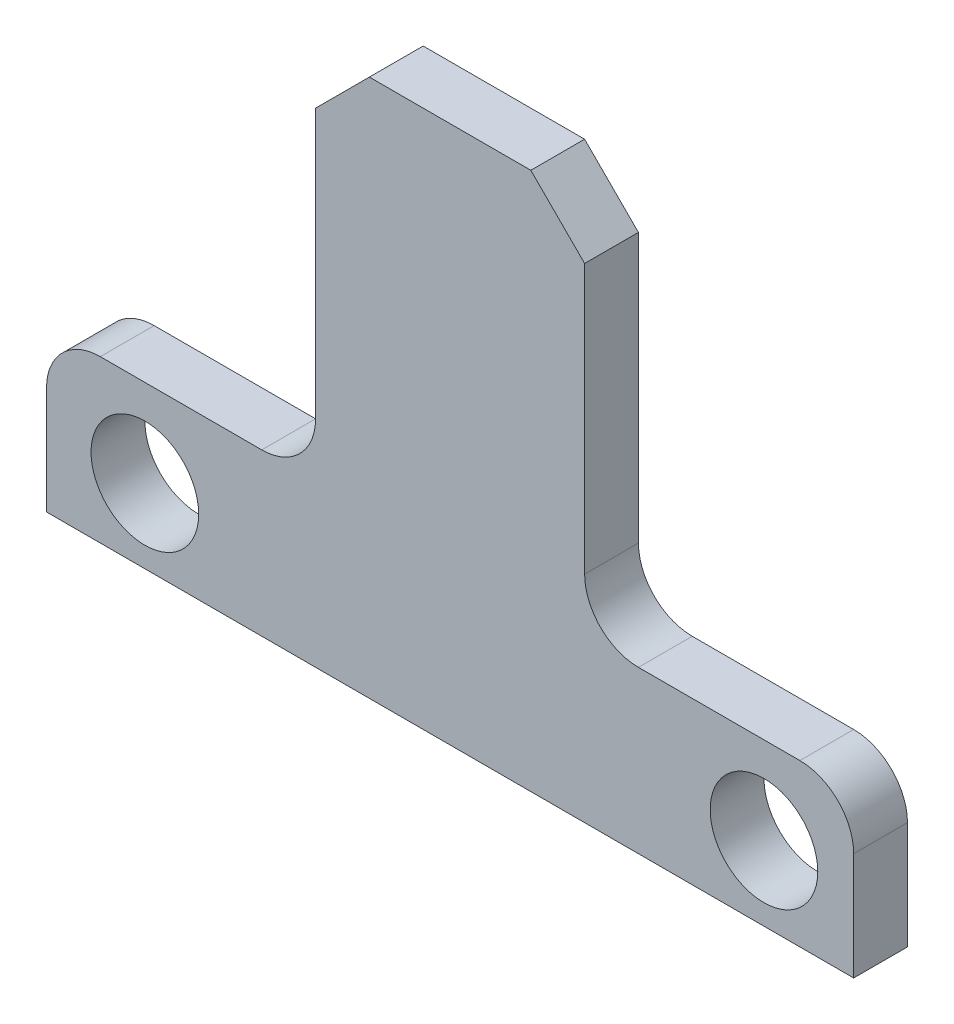
ISO-10303-21;
HEADER;
FILE_DESCRIPTION(('STEP AP214'),'2;1');
FILE_NAME('part.step','',(''),(''),'','','');
FILE_SCHEMA(('AUTOMOTIVE_DESIGN { 1 0 10303 214 1 1 1 1 }'));
ENDSEC;
DATA;
#1=APPLICATION_CONTEXT('core data for automotive mechanical design processes');
#2=APPLICATION_PROTOCOL_DEFINITION('international standard','automotive_design',2000,#1);
#3=PRODUCT_CONTEXT('',#1,'mechanical');
#4=PRODUCT('Part','Part','',(#3));
#5=PRODUCT_RELATED_PRODUCT_CATEGORY('part','',(#4));
#6=PRODUCT_DEFINITION_FORMATION('','',#4);
#7=PRODUCT_DEFINITION_CONTEXT('part definition',#1,'design');
#8=PRODUCT_DEFINITION('design','',#6,#7);
#9=PRODUCT_DEFINITION_SHAPE('','',#8);
#10=(LENGTH_UNIT() NAMED_UNIT(*) SI_UNIT(.MILLI.,.METRE.));
#11=(NAMED_UNIT(*) PLANE_ANGLE_UNIT() SI_UNIT($,.RADIAN.));
#12=(NAMED_UNIT(*) SI_UNIT($,.STERADIAN.) SOLID_ANGLE_UNIT());
#13=UNCERTAINTY_MEASURE_WITH_UNIT(LENGTH_MEASURE(1.E-05),#10,'distance_accuracy_value','');
#14=(GEOMETRIC_REPRESENTATION_CONTEXT(3) GLOBAL_UNCERTAINTY_ASSIGNED_CONTEXT((#13)) GLOBAL_UNIT_ASSIGNED_CONTEXT((#10,
#11,#12)) REPRESENTATION_CONTEXT('',''));
#15=CARTESIAN_POINT('',(0.,0.,0.));
#16=DIRECTION('',(0.,0.,1.));
#17=DIRECTION('',(1.,0.,0.));
#18=AXIS2_PLACEMENT_3D('',#15,#16,#17);
#19=CARTESIAN_POINT('',(-53.2727253400364,-24.3292399224025,10.));
#20=DIRECTION('',(0.,0.,-1.));
#21=DIRECTION('',(-1.,0.,0.));
#22=AXIS2_PLACEMENT_3D('',#19,#20,#21);
#23=PLANE('',#22);
#24=CARTESIAN_POINT('',(-53.2727253400364,-24.3292399224025,10.));
#25=DIRECTION('',(0.,0.,-1.));
#26=DIRECTION('',(-1.,0.,0.));
#27=AXIS2_PLACEMENT_3D('',#24,#25,#26);
#28=CIRCLE('',#27,10.);
#29=CARTESIAN_POINT('',(-43.2727253400364,-24.3292399224025,10.));
#30=VERTEX_POINT('',#29);
#31=CARTESIAN_POINT('',(-53.2727253400364,-34.3292399224025,10.));
#32=VERTEX_POINT('',#31);
#33=EDGE_CURVE('E222',#30,#32,#28,.T.);
#34=ORIENTED_EDGE('',*,*,#33,.T.);
#35=DIRECTION('',(-1.,0.,0.));
#36=VECTOR('',#35,1.);
#37=CARTESIAN_POINT('',(-53.2727253400364,-34.3292399224025,10.));
#38=LINE('',#37,#36);
#39=CARTESIAN_POINT('',(-83.2727253400364,-34.3292399224025,10.));
#40=VERTEX_POINT('',#39);
#41=EDGE_CURVE('E122',#32,#40,#38,.T.);
#42=ORIENTED_EDGE('',*,*,#41,.T.);
#43=CARTESIAN_POINT('',(-83.2727253400364,-44.3292399224025,10.));
#44=DIRECTION('',(0.,0.,1.));
#45=DIRECTION('',(1.,0.,0.));
#46=AXIS2_PLACEMENT_3D('',#43,#44,#45);
#47=CIRCLE('',#46,10.);
#48=CARTESIAN_POINT('',(-93.2727253400364,-44.3292399224025,10.));
#49=VERTEX_POINT('',#48);
#50=EDGE_CURVE('E267',#40,#49,#47,.T.);
#51=ORIENTED_EDGE('',*,*,#50,.T.);
#52=DIRECTION('',(0.,-1.,0.));
#53=VECTOR('',#52,1.);
#54=CARTESIAN_POINT('',(-93.2727253400364,-44.3292399224025,10.));
#55=LINE('',#54,#53);
#56=CARTESIAN_POINT('',(-93.2727253400364,-64.3292399224025,10.));
#57=VERTEX_POINT('',#56);
#58=EDGE_CURVE('E287',#49,#57,#55,.T.);
#59=ORIENTED_EDGE('',*,*,#58,.T.);
#60=DIRECTION('',(1.,0.,0.));
#61=VECTOR('',#60,1.);
#62=CARTESIAN_POINT('',(-93.2727253400364,-64.3292399224025,10.));
#63=LINE('',#62,#61);
#64=CARTESIAN_POINT('',(56.7272746599636,-64.3292399224025,10.));
#65=VERTEX_POINT('',#64);
#66=EDGE_CURVE('E283',#57,#65,#63,.T.);
#67=ORIENTED_EDGE('',*,*,#66,.T.);
#68=DIRECTION('',(0.,1.,0.));
#69=VECTOR('',#68,1.);
#70=CARTESIAN_POINT('',(56.7272746599636,-44.3292399224025,10.));
#71=LINE('',#70,#69);
#72=CARTESIAN_POINT('',(56.7272746599636,-44.3292399224025,10.));
#73=VERTEX_POINT('',#72);
#74=EDGE_CURVE('E286',#65,#73,#71,.T.);
#75=ORIENTED_EDGE('',*,*,#74,.T.);
#76=CARTESIAN_POINT('',(46.7272746599636,-44.3292399224025,10.));
#77=DIRECTION('',(0.,0.,1.));
#78=DIRECTION('',(-1.,0.,0.));
#79=AXIS2_PLACEMENT_3D('',#76,#77,#78);
#80=CIRCLE('',#79,10.);
#81=CARTESIAN_POINT('',(46.7272746599636,-34.3292399224025,10.));
#82=VERTEX_POINT('',#81);
#83=EDGE_CURVE('E291',#73,#82,#80,.T.);
#84=ORIENTED_EDGE('',*,*,#83,.T.);
#85=DIRECTION('',(-1.,0.,0.));
#86=VECTOR('',#85,1.);
#87=CARTESIAN_POINT('',(16.7272746599636,-34.3292399224025,10.));
#88=LINE('',#87,#86);
#89=CARTESIAN_POINT('',(16.7272746599636,-34.3292399224025,10.));
#90=VERTEX_POINT('',#89);
#91=EDGE_CURVE('E298',#82,#90,#88,.T.);
#92=ORIENTED_EDGE('',*,*,#91,.T.);
#93=CARTESIAN_POINT('',(16.7272746599636,-24.3292399224025,10.));
#94=DIRECTION('',(0.,0.,-1.));
#95=DIRECTION('',(1.,0.,0.));
#96=AXIS2_PLACEMENT_3D('',#93,#94,#95);
#97=CIRCLE('',#96,10.);
#98=CARTESIAN_POINT('',(6.72727465996364,-24.3292399224025,10.));
#99=VERTEX_POINT('',#98);
#100=EDGE_CURVE('E301',#90,#99,#97,.T.);
#101=ORIENTED_EDGE('',*,*,#100,.T.);
#102=DIRECTION('',(0.,1.,0.));
#103=VECTOR('',#102,1.);
#104=CARTESIAN_POINT('',(6.72727465996363,25.6707600775975,10.));
#105=LINE('',#104,#103);
#106=CARTESIAN_POINT('',(6.72727465996363,25.6707600775975,10.));
#107=VERTEX_POINT('',#106);
#108=EDGE_CURVE('E304',#99,#107,#105,.T.);
#109=ORIENTED_EDGE('',*,*,#108,.T.);
#110=DIRECTION('',(-0.707106781186548,0.707106781186548,0.));
#111=VECTOR('',#110,1.);
#112=CARTESIAN_POINT('',(-3.27272534003637,35.6707600775975,10.));
#113=LINE('',#112,#111);
#114=CARTESIAN_POINT('',(-3.27272534003637,35.6707600775975,10.));
#115=VERTEX_POINT('',#114);
#116=EDGE_CURVE('E159',#107,#115,#113,.T.);
#117=ORIENTED_EDGE('',*,*,#116,.T.);
#118=DIRECTION('',(-1.,0.,0.));
#119=VECTOR('',#118,1.);
#120=CARTESIAN_POINT('',(-33.2727253400364,35.6707600775975,10.));
#121=LINE('',#120,#119);
#122=CARTESIAN_POINT('',(-33.2727253400364,35.6707600775975,10.));
#123=VERTEX_POINT('',#122);
#124=EDGE_CURVE('E153',#115,#123,#121,.T.);
#125=ORIENTED_EDGE('',*,*,#124,.T.);
#126=DIRECTION('',(-0.707106781186548,-0.707106781186548,0.));
#127=VECTOR('',#126,1.);
#128=CARTESIAN_POINT('',(-43.2727253400364,25.6707600775975,10.));
#129=LINE('',#128,#127);
#130=CARTESIAN_POINT('',(-43.2727253400364,25.6707600775975,10.));
#131=VERTEX_POINT('',#130);
#132=EDGE_CURVE('E157',#123,#131,#129,.T.);
#133=ORIENTED_EDGE('',*,*,#132,.T.);
#134=DIRECTION('',(0.,-1.,0.));
#135=VECTOR('',#134,1.);
#136=CARTESIAN_POINT('',(-43.2727253400364,25.6707600775975,10.));
#137=LINE('',#136,#135);
#138=EDGE_CURVE('E61',#131,#30,#137,.T.);
#139=ORIENTED_EDGE('',*,*,#138,.T.);
#140=EDGE_LOOP('',(#34,#42,#51,#59,#67,#75,#84,#92,#101,#109,#117,#125,#133,#139));
#141=FACE_BOUND('',#140,.T.);
#142=CARTESIAN_POINT('',(-74.9963111467522,-50.5463211682411,10.));
#143=DIRECTION('',(0.,0.,1.));
#144=DIRECTION('',(1.,0.,0.));
#145=AXIS2_PLACEMENT_3D('',#142,#143,#144);
#146=CIRCLE('',#145,9.99999999999999);
#147=CARTESIAN_POINT('',(-64.9963111467522,-50.5463211682411,10.));
#148=VERTEX_POINT('',#147);
#149=EDGE_CURVE('E186',#148,#148,#146,.T.);
#150=ORIENTED_EDGE('',*,*,#149,.F.);
#151=EDGE_LOOP('',(#150));
#152=FACE_BOUND('',#151,.T.);
#153=CARTESIAN_POINT('',(40.0565092674661,-50.5463211682411,10.));
#154=DIRECTION('',(0.,0.,1.));
#155=DIRECTION('',(1.,0.,0.));
#156=AXIS2_PLACEMENT_3D('',#153,#154,#155);
#157=CIRCLE('',#156,10.);
#158=CARTESIAN_POINT('',(50.0565092674661,-50.5463211682411,10.));
#159=VERTEX_POINT('',#158);
#160=EDGE_CURVE('E347',#159,#159,#157,.T.);
#161=ORIENTED_EDGE('',*,*,#160,.F.);
#162=EDGE_LOOP('',(#161));
#163=FACE_BOUND('',#162,.T.);
#164=ADVANCED_FACE('F43',(#141,#152,#163),#23,.F.);
#165=CARTESIAN_POINT('',(-53.2727253400364,-24.3292399224025,0.));
#166=DIRECTION('',(0.,0.,-1.));
#167=DIRECTION('',(-1.,0.,0.));
#168=AXIS2_PLACEMENT_3D('',#165,#166,#167);
#169=PLANE('',#168);
#170=CARTESIAN_POINT('',(-74.9963111467522,-50.5463211682411,0.));
#171=DIRECTION('',(0.,0.,1.));
#172=DIRECTION('',(1.,0.,0.));
#173=AXIS2_PLACEMENT_3D('',#170,#171,#172);
#174=CIRCLE('',#173,9.99999999999999);
#175=CARTESIAN_POINT('',(-64.9963111467522,-50.5463211682411,0.));
#176=VERTEX_POINT('',#175);
#177=EDGE_CURVE('E354',#176,#176,#174,.T.);
#178=ORIENTED_EDGE('',*,*,#177,.T.);
#179=EDGE_LOOP('',(#178));
#180=FACE_BOUND('',#179,.T.);
#181=CARTESIAN_POINT('',(-53.2727253400364,-24.3292399224025,0.));
#182=DIRECTION('',(0.,0.,-1.));
#183=DIRECTION('',(-1.,0.,0.));
#184=AXIS2_PLACEMENT_3D('',#181,#182,#183);
#185=CIRCLE('',#184,10.);
#186=CARTESIAN_POINT('',(-43.2727253400364,-24.3292399224025,0.));
#187=VERTEX_POINT('',#186);
#188=CARTESIAN_POINT('',(-53.2727253400364,-34.3292399224025,0.));
#189=VERTEX_POINT('',#188);
#190=EDGE_CURVE('E181',#187,#189,#185,.T.);
#191=ORIENTED_EDGE('',*,*,#190,.F.);
#192=DIRECTION('',(0.,-1.,0.));
#193=VECTOR('',#192,1.);
#194=CARTESIAN_POINT('',(-43.2727253400364,25.6707600775975,0.));
#195=LINE('',#194,#193);
#196=CARTESIAN_POINT('',(-43.2727253400364,25.6707600775975,0.));
#197=VERTEX_POINT('',#196);
#198=EDGE_CURVE('E114',#197,#187,#195,.T.);
#199=ORIENTED_EDGE('',*,*,#198,.F.);
#200=DIRECTION('',(-0.707106781186548,-0.707106781186548,0.));
#201=VECTOR('',#200,1.);
#202=CARTESIAN_POINT('',(-43.2727253400364,25.6707600775975,0.));
#203=LINE('',#202,#201);
#204=CARTESIAN_POINT('',(-33.2727253400364,35.6707600775975,0.));
#205=VERTEX_POINT('',#204);
#206=EDGE_CURVE('E108',#205,#197,#203,.T.);
#207=ORIENTED_EDGE('',*,*,#206,.F.);
#208=DIRECTION('',(-1.,0.,0.));
#209=VECTOR('',#208,1.);
#210=CARTESIAN_POINT('',(-33.2727253400364,35.6707600775975,0.));
#211=LINE('',#210,#209);
#212=CARTESIAN_POINT('',(-3.27272534003637,35.6707600775975,0.));
#213=VERTEX_POINT('',#212);
#214=EDGE_CURVE('E168',#213,#205,#211,.T.);
#215=ORIENTED_EDGE('',*,*,#214,.F.);
#216=DIRECTION('',(-0.707106781186548,0.707106781186548,0.));
#217=VECTOR('',#216,1.);
#218=CARTESIAN_POINT('',(-3.27272534003637,35.6707600775975,0.));
#219=LINE('',#218,#217);
#220=CARTESIAN_POINT('',(6.72727465996363,25.6707600775975,0.));
#221=VERTEX_POINT('',#220);
#222=EDGE_CURVE('E213',#221,#213,#219,.T.);
#223=ORIENTED_EDGE('',*,*,#222,.F.);
#224=DIRECTION('',(0.,1.,0.));
#225=VECTOR('',#224,1.);
#226=CARTESIAN_POINT('',(6.72727465996363,25.6707600775975,0.));
#227=LINE('',#226,#225);
#228=CARTESIAN_POINT('',(6.72727465996364,-24.3292399224025,0.));
#229=VERTEX_POINT('',#228);
#230=EDGE_CURVE('E210',#229,#221,#227,.T.);
#231=ORIENTED_EDGE('',*,*,#230,.F.);
#232=CARTESIAN_POINT('',(16.7272746599636,-24.3292399224025,0.));
#233=DIRECTION('',(0.,0.,-1.));
#234=DIRECTION('',(1.,0.,0.));
#235=AXIS2_PLACEMENT_3D('',#232,#233,#234);
#236=CIRCLE('',#235,10.);
#237=CARTESIAN_POINT('',(16.7272746599636,-34.3292399224025,0.));
#238=VERTEX_POINT('',#237);
#239=EDGE_CURVE('E207',#238,#229,#236,.T.);
#240=ORIENTED_EDGE('',*,*,#239,.F.);
#241=DIRECTION('',(-1.,0.,0.));
#242=VECTOR('',#241,1.);
#243=CARTESIAN_POINT('',(16.7272746599636,-34.3292399224025,0.));
#244=LINE('',#243,#242);
#245=CARTESIAN_POINT('',(46.7272746599636,-34.3292399224025,0.));
#246=VERTEX_POINT('',#245);
#247=EDGE_CURVE('E204',#246,#238,#244,.T.);
#248=ORIENTED_EDGE('',*,*,#247,.F.);
#249=CARTESIAN_POINT('',(46.7272746599636,-44.3292399224025,0.));
#250=DIRECTION('',(0.,0.,1.));
#251=DIRECTION('',(-1.,0.,0.));
#252=AXIS2_PLACEMENT_3D('',#249,#250,#251);
#253=CIRCLE('',#252,10.);
#254=CARTESIAN_POINT('',(56.7272746599636,-44.3292399224025,0.));
#255=VERTEX_POINT('',#254);
#256=EDGE_CURVE('E201',#255,#246,#253,.T.);
#257=ORIENTED_EDGE('',*,*,#256,.F.);
#258=DIRECTION('',(0.,1.,0.));
#259=VECTOR('',#258,1.);
#260=CARTESIAN_POINT('',(56.7272746599636,-44.3292399224025,0.));
#261=LINE('',#260,#259);
#262=CARTESIAN_POINT('',(56.7272746599636,-64.3292399224025,0.));
#263=VERTEX_POINT('',#262);
#264=EDGE_CURVE('E198',#263,#255,#261,.T.);
#265=ORIENTED_EDGE('',*,*,#264,.F.);
#266=DIRECTION('',(1.,0.,0.));
#267=VECTOR('',#266,1.);
#268=CARTESIAN_POINT('',(-93.2727253400364,-64.3292399224025,0.));
#269=LINE('',#268,#267);
#270=CARTESIAN_POINT('',(-93.2727253400364,-64.3292399224025,0.));
#271=VERTEX_POINT('',#270);
#272=EDGE_CURVE('E195',#271,#263,#269,.T.);
#273=ORIENTED_EDGE('',*,*,#272,.F.);
#274=DIRECTION('',(0.,-1.,0.));
#275=VECTOR('',#274,1.);
#276=CARTESIAN_POINT('',(-93.2727253400364,-44.3292399224025,0.));
#277=LINE('',#276,#275);
#278=CARTESIAN_POINT('',(-93.2727253400364,-44.3292399224025,0.));
#279=VERTEX_POINT('',#278);
#280=EDGE_CURVE('E192',#279,#271,#277,.T.);
#281=ORIENTED_EDGE('',*,*,#280,.F.);
#282=CARTESIAN_POINT('',(-83.2727253400364,-44.3292399224025,0.));
#283=DIRECTION('',(0.,0.,1.));
#284=DIRECTION('',(1.,0.,0.));
#285=AXIS2_PLACEMENT_3D('',#282,#283,#284);
#286=CIRCLE('',#285,10.);
#287=CARTESIAN_POINT('',(-83.2727253400364,-34.3292399224025,0.));
#288=VERTEX_POINT('',#287);
#289=EDGE_CURVE('E189',#288,#279,#286,.T.);
#290=ORIENTED_EDGE('',*,*,#289,.F.);
#291=DIRECTION('',(-1.,0.,0.));
#292=VECTOR('',#291,1.);
#293=CARTESIAN_POINT('',(-53.2727253400364,-34.3292399224025,0.));
#294=LINE('',#293,#292);
#295=EDGE_CURVE('E185',#189,#288,#294,.T.);
#296=ORIENTED_EDGE('',*,*,#295,.F.);
#297=EDGE_LOOP('',(#191,#199,#207,#215,#223,#231,#240,#248,#257,#265,#273,#281,#290,#296));
#298=FACE_BOUND('',#297,.T.);
#299=CARTESIAN_POINT('',(40.0565092674661,-50.5463211682411,0.));
#300=DIRECTION('',(0.,0.,1.));
#301=DIRECTION('',(1.,0.,0.));
#302=AXIS2_PLACEMENT_3D('',#299,#300,#301);
#303=CIRCLE('',#302,10.);
#304=CARTESIAN_POINT('',(50.0565092674661,-50.5463211682411,0.));
#305=VERTEX_POINT('',#304);
#306=EDGE_CURVE('E350',#305,#305,#303,.T.);
#307=ORIENTED_EDGE('',*,*,#306,.T.);
#308=EDGE_LOOP('',(#307));
#309=FACE_BOUND('',#308,.T.);
#310=ADVANCED_FACE('F271',(#180,#298,#309),#169,.T.);
#311=CARTESIAN_POINT('',(-53.2727253400364,-24.3292399224025,10.));
#312=DIRECTION('',(0.,0.,-1.));
#313=DIRECTION('',(-1.,0.,0.));
#314=AXIS2_PLACEMENT_3D('',#311,#312,#313);
#315=CYLINDRICAL_SURFACE('',#314,10.);
#316=ORIENTED_EDGE('',*,*,#190,.T.);
#317=DIRECTION('',(0.,0.,-1.));
#318=VECTOR('',#317,1.);
#319=CARTESIAN_POINT('',(-53.2727253400364,-34.3292399224025,10.));
#320=LINE('',#319,#318);
#321=EDGE_CURVE('E11',#32,#189,#320,.T.);
#322=ORIENTED_EDGE('',*,*,#321,.F.);
#323=ORIENTED_EDGE('',*,*,#33,.F.);
#324=DIRECTION('',(0.,0.,-1.));
#325=VECTOR('',#324,1.);
#326=CARTESIAN_POINT('',(-43.2727253400364,-24.3292399224025,10.));
#327=LINE('',#326,#325);
#328=EDGE_CURVE('E177',#30,#187,#327,.T.);
#329=ORIENTED_EDGE('',*,*,#328,.T.);
#330=EDGE_LOOP('',(#316,#322,#323,#329));
#331=FACE_BOUND('',#330,.T.);
#332=ADVANCED_FACE('F45',(#331),#315,.F.);
#333=CARTESIAN_POINT('',(-53.2727253400364,-34.3292399224025,10.));
#334=DIRECTION('',(0.,-1.,0.));
#335=DIRECTION('',(0.,0.,-1.));
#336=AXIS2_PLACEMENT_3D('',#333,#334,#335);
#337=PLANE('',#336);
#338=ORIENTED_EDGE('',*,*,#295,.T.);
#339=DIRECTION('',(0.,0.,-1.));
#340=VECTOR('',#339,1.);
#341=CARTESIAN_POINT('',(-83.2727253400364,-34.3292399224025,10.));
#342=LINE('',#341,#340);
#343=EDGE_CURVE('E53',#40,#288,#342,.T.);
#344=ORIENTED_EDGE('',*,*,#343,.F.);
#345=ORIENTED_EDGE('',*,*,#41,.F.);
#346=ORIENTED_EDGE('',*,*,#321,.T.);
#347=EDGE_LOOP('',(#338,#344,#345,#346));
#348=FACE_BOUND('',#347,.T.);
#349=ADVANCED_FACE('F486',(#348),#337,.F.);
#350=CARTESIAN_POINT('',(-83.2727253400364,-44.3292399224025,10.));
#351=DIRECTION('',(0.,0.,-1.));
#352=DIRECTION('',(-1.,0.,0.));
#353=AXIS2_PLACEMENT_3D('',#350,#351,#352);
#354=CYLINDRICAL_SURFACE('',#353,10.);
#355=ORIENTED_EDGE('',*,*,#289,.T.);
#356=DIRECTION('',(0.,0.,-1.));
#357=VECTOR('',#356,1.);
#358=CARTESIAN_POINT('',(-93.2727253400364,-44.3292399224025,10.));
#359=LINE('',#358,#357);
#360=EDGE_CURVE('E257',#49,#279,#359,.T.);
#361=ORIENTED_EDGE('',*,*,#360,.F.);
#362=ORIENTED_EDGE('',*,*,#50,.F.);
#363=ORIENTED_EDGE('',*,*,#343,.T.);
#364=EDGE_LOOP('',(#355,#361,#362,#363));
#365=FACE_BOUND('',#364,.T.);
#366=ADVANCED_FACE('F265',(#365),#354,.T.);
#367=CARTESIAN_POINT('',(-93.2727253400364,-44.3292399224025,10.));
#368=DIRECTION('',(1.,0.,0.));
#369=DIRECTION('',(0.,0.,-1.));
#370=AXIS2_PLACEMENT_3D('',#367,#368,#369);
#371=PLANE('',#370);
#372=ORIENTED_EDGE('',*,*,#280,.T.);
#373=DIRECTION('',(0.,0.,-1.));
#374=VECTOR('',#373,1.);
#375=CARTESIAN_POINT('',(-93.2727253400364,-64.3292399224025,10.));
#376=LINE('',#375,#374);
#377=EDGE_CURVE('E253',#57,#271,#376,.T.);
#378=ORIENTED_EDGE('',*,*,#377,.F.);
#379=ORIENTED_EDGE('',*,*,#58,.F.);
#380=ORIENTED_EDGE('',*,*,#360,.T.);
#381=EDGE_LOOP('',(#372,#378,#379,#380));
#382=FACE_BOUND('',#381,.T.);
#383=ADVANCED_FACE('F277',(#382),#371,.F.);
#384=CARTESIAN_POINT('',(-93.2727253400364,-64.3292399224025,10.));
#385=DIRECTION('',(0.,1.,0.));
#386=DIRECTION('',(0.,0.,1.));
#387=AXIS2_PLACEMENT_3D('',#384,#385,#386);
#388=PLANE('',#387);
#389=ORIENTED_EDGE('',*,*,#272,.T.);
#390=DIRECTION('',(0.,0.,-1.));
#391=VECTOR('',#390,1.);
#392=CARTESIAN_POINT('',(56.7272746599636,-64.3292399224025,10.));
#393=LINE('',#392,#391);
#394=EDGE_CURVE('E249',#65,#263,#393,.T.);
#395=ORIENTED_EDGE('',*,*,#394,.F.);
#396=ORIENTED_EDGE('',*,*,#66,.F.);
#397=ORIENTED_EDGE('',*,*,#377,.T.);
#398=EDGE_LOOP('',(#389,#395,#396,#397));
#399=FACE_BOUND('',#398,.T.);
#400=ADVANCED_FACE('F281',(#399),#388,.F.);
#401=CARTESIAN_POINT('',(56.7272746599636,-44.3292399224025,10.));
#402=DIRECTION('',(-1.,0.,0.));
#403=DIRECTION('',(0.,0.,1.));
#404=AXIS2_PLACEMENT_3D('',#401,#402,#403);
#405=PLANE('',#404);
#406=ORIENTED_EDGE('',*,*,#264,.T.);
#407=DIRECTION('',(0.,0.,-1.));
#408=VECTOR('',#407,1.);
#409=CARTESIAN_POINT('',(56.7272746599636,-44.3292399224025,10.));
#410=LINE('',#409,#408);
#411=EDGE_CURVE('E245',#73,#255,#410,.T.);
#412=ORIENTED_EDGE('',*,*,#411,.F.);
#413=ORIENTED_EDGE('',*,*,#74,.F.);
#414=ORIENTED_EDGE('',*,*,#394,.T.);
#415=EDGE_LOOP('',(#406,#412,#413,#414));
#416=FACE_BOUND('',#415,.T.);
#417=ADVANCED_FACE('F447',(#416),#405,.F.);
#418=CARTESIAN_POINT('',(46.7272746599636,-44.3292399224025,10.));
#419=DIRECTION('',(0.,0.,-1.));
#420=DIRECTION('',(-1.,0.,0.));
#421=AXIS2_PLACEMENT_3D('',#418,#419,#420);
#422=CYLINDRICAL_SURFACE('',#421,10.);
#423=ORIENTED_EDGE('',*,*,#256,.T.);
#424=DIRECTION('',(0.,0.,-1.));
#425=VECTOR('',#424,1.);
#426=CARTESIAN_POINT('',(46.7272746599636,-34.3292399224025,10.));
#427=LINE('',#426,#425);
#428=EDGE_CURVE('E241',#82,#246,#427,.T.);
#429=ORIENTED_EDGE('',*,*,#428,.F.);
#430=ORIENTED_EDGE('',*,*,#83,.F.);
#431=ORIENTED_EDGE('',*,*,#411,.T.);
#432=EDGE_LOOP('',(#423,#429,#430,#431));
#433=FACE_BOUND('',#432,.T.);
#434=ADVANCED_FACE('F436',(#433),#422,.T.);
#435=CARTESIAN_POINT('',(16.7272746599636,-34.3292399224025,10.));
#436=DIRECTION('',(0.,-1.,0.));
#437=DIRECTION('',(0.,0.,-1.));
#438=AXIS2_PLACEMENT_3D('',#435,#436,#437);
#439=PLANE('',#438);
#440=ORIENTED_EDGE('',*,*,#247,.T.);
#441=DIRECTION('',(0.,0.,-1.));
#442=VECTOR('',#441,1.);
#443=CARTESIAN_POINT('',(16.7272746599636,-34.3292399224025,10.));
#444=LINE('',#443,#442);
#445=EDGE_CURVE('E237',#90,#238,#444,.T.);
#446=ORIENTED_EDGE('',*,*,#445,.F.);
#447=ORIENTED_EDGE('',*,*,#91,.F.);
#448=ORIENTED_EDGE('',*,*,#428,.T.);
#449=EDGE_LOOP('',(#440,#446,#447,#448));
#450=FACE_BOUND('',#449,.T.);
#451=ADVANCED_FACE('F425',(#450),#439,.F.);
#452=CARTESIAN_POINT('',(16.7272746599636,-24.3292399224025,10.));
#453=DIRECTION('',(0.,0.,-1.));
#454=DIRECTION('',(-1.,0.,0.));
#455=AXIS2_PLACEMENT_3D('',#452,#453,#454);
#456=CYLINDRICAL_SURFACE('',#455,10.);
#457=ORIENTED_EDGE('',*,*,#239,.T.);
#458=DIRECTION('',(0.,0.,-1.));
#459=VECTOR('',#458,1.);
#460=CARTESIAN_POINT('',(6.72727465996364,-24.3292399224025,10.));
#461=LINE('',#460,#459);
#462=EDGE_CURVE('E233',#99,#229,#461,.T.);
#463=ORIENTED_EDGE('',*,*,#462,.F.);
#464=ORIENTED_EDGE('',*,*,#100,.F.);
#465=ORIENTED_EDGE('',*,*,#445,.T.);
#466=EDGE_LOOP('',(#457,#463,#464,#465));
#467=FACE_BOUND('',#466,.T.);
#468=ADVANCED_FACE('F415',(#467),#456,.F.);
#469=CARTESIAN_POINT('',(6.72727465996363,25.6707600775975,10.));
#470=DIRECTION('',(-1.,0.,0.));
#471=DIRECTION('',(0.,-1.,0.));
#472=AXIS2_PLACEMENT_3D('',#469,#470,#471);
#473=PLANE('',#472);
#474=ORIENTED_EDGE('',*,*,#230,.T.);
#475=DIRECTION('',(0.,0.,-1.));
#476=VECTOR('',#475,1.);
#477=CARTESIAN_POINT('',(6.72727465996363,25.6707600775975,10.));
#478=LINE('',#477,#476);
#479=EDGE_CURVE('E229',#107,#221,#478,.T.);
#480=ORIENTED_EDGE('',*,*,#479,.F.);
#481=ORIENTED_EDGE('',*,*,#108,.F.);
#482=ORIENTED_EDGE('',*,*,#462,.T.);
#483=EDGE_LOOP('',(#474,#480,#481,#482));
#484=FACE_BOUND('',#483,.T.);
#485=ADVANCED_FACE('F312',(#484),#473,.F.);
#486=CARTESIAN_POINT('',(-3.27272534003637,35.6707600775975,10.));
#487=DIRECTION('',(-0.707106781186548,-0.707106781186548,0.));
#488=DIRECTION('',(0.707106781186548,-0.707106781186548,0.));
#489=AXIS2_PLACEMENT_3D('',#486,#487,#488);
#490=PLANE('',#489);
#491=ORIENTED_EDGE('',*,*,#222,.T.);
#492=DIRECTION('',(0.,0.,-1.));
#493=VECTOR('',#492,1.);
#494=CARTESIAN_POINT('',(-3.27272534003637,35.6707600775975,10.));
#495=LINE('',#494,#493);
#496=EDGE_CURVE('E170',#115,#213,#495,.T.);
#497=ORIENTED_EDGE('',*,*,#496,.F.);
#498=ORIENTED_EDGE('',*,*,#116,.F.);
#499=ORIENTED_EDGE('',*,*,#479,.T.);
#500=EDGE_LOOP('',(#491,#497,#498,#499));
#501=FACE_BOUND('',#500,.T.);
#502=ADVANCED_FACE('F316',(#501),#490,.F.);
#503=CARTESIAN_POINT('',(-33.2727253400364,35.6707600775975,10.));
#504=DIRECTION('',(0.,-1.,0.));
#505=DIRECTION('',(0.,0.,-1.));
#506=AXIS2_PLACEMENT_3D('',#503,#504,#505);
#507=PLANE('',#506);
#508=ORIENTED_EDGE('',*,*,#214,.T.);
#509=DIRECTION('',(0.,0.,-1.));
#510=VECTOR('',#509,1.);
#511=CARTESIAN_POINT('',(-33.2727253400364,35.6707600775975,10.));
#512=LINE('',#511,#510);
#513=EDGE_CURVE('E165',#123,#205,#512,.T.);
#514=ORIENTED_EDGE('',*,*,#513,.F.);
#515=ORIENTED_EDGE('',*,*,#124,.F.);
#516=ORIENTED_EDGE('',*,*,#496,.T.);
#517=EDGE_LOOP('',(#508,#514,#515,#516));
#518=FACE_BOUND('',#517,.T.);
#519=ADVANCED_FACE('F166',(#518),#507,.F.);
#520=CARTESIAN_POINT('',(-43.2727253400364,25.6707600775975,10.));
#521=DIRECTION('',(0.707106781186548,-0.707106781186548,0.));
#522=DIRECTION('',(0.707106781186548,0.707106781186548,0.));
#523=AXIS2_PLACEMENT_3D('',#520,#521,#522);
#524=PLANE('',#523);
#525=ORIENTED_EDGE('',*,*,#206,.T.);
#526=DIRECTION('',(0.,0.,-1.));
#527=VECTOR('',#526,1.);
#528=CARTESIAN_POINT('',(-43.2727253400364,25.6707600775975,10.));
#529=LINE('',#528,#527);
#530=EDGE_CURVE('E171',#131,#197,#529,.T.);
#531=ORIENTED_EDGE('',*,*,#530,.F.);
#532=ORIENTED_EDGE('',*,*,#132,.F.);
#533=ORIENTED_EDGE('',*,*,#513,.T.);
#534=EDGE_LOOP('',(#525,#531,#532,#533));
#535=FACE_BOUND('',#534,.T.);
#536=ADVANCED_FACE('F173',(#535),#524,.F.);
#537=CARTESIAN_POINT('',(-43.2727253400364,25.6707600775975,10.));
#538=DIRECTION('',(1.,0.,0.));
#539=DIRECTION('',(0.,1.,0.));
#540=AXIS2_PLACEMENT_3D('',#537,#538,#539);
#541=PLANE('',#540);
#542=ORIENTED_EDGE('',*,*,#198,.T.);
#543=ORIENTED_EDGE('',*,*,#328,.F.);
#544=ORIENTED_EDGE('',*,*,#138,.F.);
#545=ORIENTED_EDGE('',*,*,#530,.T.);
#546=EDGE_LOOP('',(#542,#543,#544,#545));
#547=FACE_BOUND('',#546,.T.);
#548=ADVANCED_FACE('F320',(#547),#541,.F.);
#549=CARTESIAN_POINT('',(-74.9963111467522,-50.5463211682411,10.));
#550=DIRECTION('',(0.,0.,-1.));
#551=DIRECTION('',(-1.,0.,0.));
#552=AXIS2_PLACEMENT_3D('',#549,#550,#551);
#553=CYLINDRICAL_SURFACE('',#552,9.99999999999999);
#554=ORIENTED_EDGE('',*,*,#149,.T.);
#555=EDGE_LOOP('',(#554));
#556=FACE_BOUND('',#555,.T.);
#557=ORIENTED_EDGE('',*,*,#177,.F.);
#558=EDGE_LOOP('',(#557));
#559=FACE_BOUND('',#558,.T.);
#560=ADVANCED_FACE('F322',(#556,#559),#553,.F.);
#561=CARTESIAN_POINT('',(40.0565092674661,-50.5463211682411,10.));
#562=DIRECTION('',(0.,0.,-1.));
#563=DIRECTION('',(-1.,0.,0.));
#564=AXIS2_PLACEMENT_3D('',#561,#562,#563);
#565=CYLINDRICAL_SURFACE('',#564,10.);
#566=ORIENTED_EDGE('',*,*,#160,.T.);
#567=EDGE_LOOP('',(#566));
#568=FACE_BOUND('',#567,.T.);
#569=ORIENTED_EDGE('',*,*,#306,.F.);
#570=EDGE_LOOP('',(#569));
#571=FACE_BOUND('',#570,.T.);
#572=ADVANCED_FACE('F328',(#568,#571),#565,.F.);
#573=CLOSED_SHELL('',(#164,#310,#332,#349,#366,#383,#400,#417,#434,#451,#468,#485,#502,#519,
#536,#548,#560,#572));
#574=MANIFOLD_SOLID_BREP('B2',#573);
#575=ADVANCED_BREP_SHAPE_REPRESENTATION('',(#18,#574),#14);
#576=SHAPE_DEFINITION_REPRESENTATION(#9,#575);
ENDSEC;
END-ISO-10303-21;
